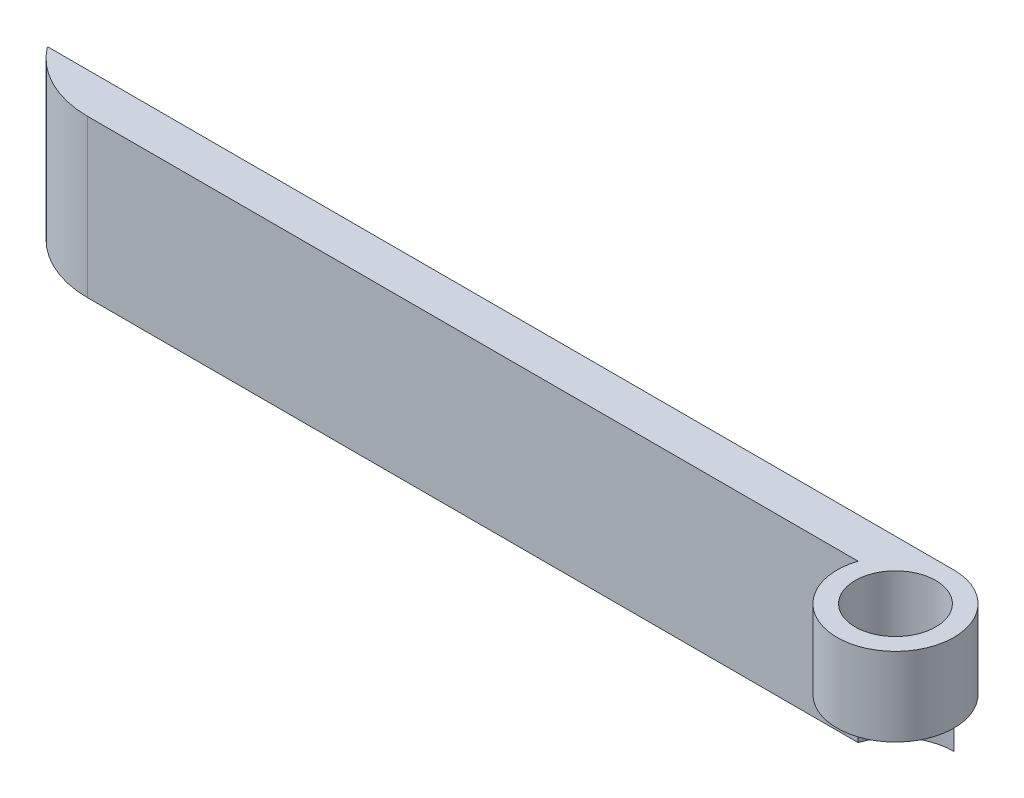
ISO-10303-21;
HEADER;
FILE_DESCRIPTION(('STEP AP214'),'2;1');
FILE_NAME('part.step','',(''),(''),'','','');
FILE_SCHEMA(('AUTOMOTIVE_DESIGN { 1 0 10303 214 1 1 1 1 }'));
ENDSEC;
DATA;
#1=APPLICATION_CONTEXT('core data for automotive mechanical design processes');
#2=APPLICATION_PROTOCOL_DEFINITION('international standard','automotive_design',2000,#1);
#3=PRODUCT_CONTEXT('',#1,'mechanical');
#4=PRODUCT('Part','Part','',(#3));
#5=PRODUCT_RELATED_PRODUCT_CATEGORY('part','',(#4));
#6=PRODUCT_DEFINITION_FORMATION('','',#4);
#7=PRODUCT_DEFINITION_CONTEXT('part definition',#1,'design');
#8=PRODUCT_DEFINITION('design','',#6,#7);
#9=PRODUCT_DEFINITION_SHAPE('','',#8);
#10=(LENGTH_UNIT() NAMED_UNIT(*) SI_UNIT(.MILLI.,.METRE.));
#11=(NAMED_UNIT(*) PLANE_ANGLE_UNIT() SI_UNIT($,.RADIAN.));
#12=(NAMED_UNIT(*) SI_UNIT($,.STERADIAN.) SOLID_ANGLE_UNIT());
#13=UNCERTAINTY_MEASURE_WITH_UNIT(LENGTH_MEASURE(1.E-05),#10,'distance_accuracy_value','');
#14=(GEOMETRIC_REPRESENTATION_CONTEXT(3) GLOBAL_UNCERTAINTY_ASSIGNED_CONTEXT((#13)) GLOBAL_UNIT_ASSIGNED_CONTEXT((#10,
#11,#12)) REPRESENTATION_CONTEXT('',''));
#15=CARTESIAN_POINT('',(0.,0.,0.));
#16=DIRECTION('',(0.,0.,1.));
#17=DIRECTION('',(1.,0.,0.));
#18=AXIS2_PLACEMENT_3D('',#15,#16,#17);
#19=CARTESIAN_POINT('',(0.,3.9,0.));
#20=DIRECTION('',(0.,-1.,0.));
#21=DIRECTION('',(0.,0.,-1.));
#22=AXIS2_PLACEMENT_3D('',#19,#20,#21);
#23=CYLINDRICAL_SURFACE('',#22,2.9);
#24=DIRECTION('',(0.,-1.,0.));
#25=VECTOR('',#24,1.);
#26=CARTESIAN_POINT('',(-2.75680975041804,3.9,-0.900000000000001));
#27=LINE('',#26,#25);
#28=CARTESIAN_POINT('',(-2.75680975041804,3.9,-0.900000000000001));
#29=VERTEX_POINT('',#28);
#30=CARTESIAN_POINT('',(-2.75680975041804,0.,-0.900000000000001));
#31=VERTEX_POINT('',#30);
#32=EDGE_CURVE('E112',#29,#31,#27,.T.);
#33=ORIENTED_EDGE('',*,*,#32,.T.);
#34=CARTESIAN_POINT('',(0.,0.,0.));
#35=DIRECTION('',(0.,1.,0.));
#36=DIRECTION('',(0.,0.,1.));
#37=AXIS2_PLACEMENT_3D('',#34,#35,#36);
#38=CIRCLE('',#37,2.9);
#39=CARTESIAN_POINT('',(0.,0.,-2.9));
#40=VERTEX_POINT('',#39);
#41=EDGE_CURVE('E108',#31,#40,#38,.T.);
#42=ORIENTED_EDGE('',*,*,#41,.T.);
#43=DIRECTION('',(0.,-1.,0.));
#44=VECTOR('',#43,1.);
#45=CARTESIAN_POINT('',(0.,3.9,-2.9));
#46=LINE('',#45,#44);
#47=CARTESIAN_POINT('',(0.,3.9,-2.9));
#48=VERTEX_POINT('',#47);
#49=EDGE_CURVE('E99',#48,#40,#46,.T.);
#50=ORIENTED_EDGE('',*,*,#49,.F.);
#51=CARTESIAN_POINT('',(0.,3.9,0.));
#52=DIRECTION('',(0.,1.,0.));
#53=DIRECTION('',(0.,0.,1.));
#54=AXIS2_PLACEMENT_3D('',#51,#52,#53);
#55=CIRCLE('',#54,2.9);
#56=EDGE_CURVE('E113',#29,#48,#55,.T.);
#57=ORIENTED_EDGE('',*,*,#56,.F.);
#58=EDGE_LOOP('',(#33,#42,#50,#57));
#59=FACE_BOUND('',#58,.T.);
#60=ADVANCED_FACE('F37',(#59),#23,.T.);
#61=CARTESIAN_POINT('',(0.,3.9,0.));
#62=DIRECTION('',(0.,1.,0.));
#63=DIRECTION('',(0.,0.,1.));
#64=AXIS2_PLACEMENT_3D('',#61,#62,#63);
#65=PLANE('',#64);
#66=DIRECTION('',(-1.,0.,0.));
#67=VECTOR('',#66,1.);
#68=CARTESIAN_POINT('',(0.,3.9,-2.9));
#69=LINE('',#68,#67);
#70=CARTESIAN_POINT('',(-45.,3.9,-2.90000000000001));
#71=VERTEX_POINT('',#70);
#72=EDGE_CURVE('E97',#48,#71,#69,.T.);
#73=ORIENTED_EDGE('',*,*,#72,.T.);
#74=CARTESIAN_POINT('',(-41.,3.9,-5.9));
#75=DIRECTION('',(0.,1.,0.));
#76=DIRECTION('',(0.,0.,1.));
#77=AXIS2_PLACEMENT_3D('',#74,#75,#76);
#78=CIRCLE('',#77,5.);
#79=CARTESIAN_POINT('',(-41.,3.9,-0.900000000000005));
#80=VERTEX_POINT('',#79);
#81=EDGE_CURVE('E11',#71,#80,#78,.T.);
#82=ORIENTED_EDGE('',*,*,#81,.T.);
#83=DIRECTION('',(1.,0.,0.));
#84=VECTOR('',#83,1.);
#85=CARTESIAN_POINT('',(0.,3.9,-0.900000000000001));
#86=LINE('',#85,#84);
#87=EDGE_CURVE('E101',#80,#29,#86,.T.);
#88=ORIENTED_EDGE('',*,*,#87,.T.);
#89=ORIENTED_EDGE('',*,*,#56,.T.);
#90=EDGE_LOOP('',(#73,#82,#88,#89));
#91=FACE_BOUND('',#90,.T.);
#92=CARTESIAN_POINT('',(0.,3.9,0.));
#93=DIRECTION('',(0.,1.,0.));
#94=DIRECTION('',(0.,0.,1.));
#95=AXIS2_PLACEMENT_3D('',#92,#93,#94);
#96=CIRCLE('',#95,2.);
#97=CARTESIAN_POINT('',(0.,3.9,2.));
#98=VERTEX_POINT('',#97);
#99=EDGE_CURVE('E105',#98,#98,#96,.T.);
#100=ORIENTED_EDGE('',*,*,#99,.F.);
#101=EDGE_LOOP('',(#100));
#102=FACE_BOUND('',#101,.T.);
#103=ADVANCED_FACE('F152',(#91,#102),#65,.T.);
#104=CARTESIAN_POINT('',(0.,0.,0.));
#105=DIRECTION('',(0.,1.,0.));
#106=DIRECTION('',(0.,0.,1.));
#107=AXIS2_PLACEMENT_3D('',#104,#105,#106);
#108=PLANE('',#107);
#109=EDGE_CURVE('E116',#40,#31,#38,.T.);
#110=ORIENTED_EDGE('',*,*,#109,.F.);
#111=ORIENTED_EDGE('',*,*,#41,.F.);
#112=EDGE_LOOP('',(#110,#111));
#113=FACE_BOUND('',#112,.T.);
#114=CARTESIAN_POINT('',(0.,0.,0.));
#115=DIRECTION('',(0.,1.,0.));
#116=DIRECTION('',(0.,0.,1.));
#117=AXIS2_PLACEMENT_3D('',#114,#115,#116);
#118=CIRCLE('',#117,2.);
#119=CARTESIAN_POINT('',(0.,0.,2.));
#120=VERTEX_POINT('',#119);
#121=EDGE_CURVE('E109',#120,#120,#118,.T.);
#122=ORIENTED_EDGE('',*,*,#121,.T.);
#123=EDGE_LOOP('',(#122));
#124=FACE_BOUND('',#123,.T.);
#125=ADVANCED_FACE('F135',(#113,#124),#108,.F.);
#126=CARTESIAN_POINT('',(0.,3.9,0.));
#127=DIRECTION('',(0.,-1.,0.));
#128=DIRECTION('',(0.,0.,-1.));
#129=AXIS2_PLACEMENT_3D('',#126,#127,#128);
#130=CYLINDRICAL_SURFACE('',#129,2.);
#131=ORIENTED_EDGE('',*,*,#99,.T.);
#132=EDGE_LOOP('',(#131));
#133=FACE_BOUND('',#132,.T.);
#134=ORIENTED_EDGE('',*,*,#121,.F.);
#135=EDGE_LOOP('',(#134));
#136=FACE_BOUND('',#135,.T.);
#137=ADVANCED_FACE('F139',(#133,#136),#130,.F.);
#138=CARTESIAN_POINT('',(0.,3.9,0.));
#139=DIRECTION('',(0.,-1.,0.));
#140=DIRECTION('',(0.,0.,-1.));
#141=AXIS2_PLACEMENT_3D('',#138,#139,#140);
#142=CYLINDRICAL_SURFACE('',#141,2.9);
#143=CARTESIAN_POINT('',(0.,-3.9,-2.9));
#144=VERTEX_POINT('',#143);
#145=EDGE_CURVE('E94',#40,#144,#46,.T.);
#146=ORIENTED_EDGE('',*,*,#145,.F.);
#147=ORIENTED_EDGE('',*,*,#109,.T.);
#148=CARTESIAN_POINT('',(-2.75680975041804,-3.9,-0.900000000000001));
#149=VERTEX_POINT('',#148);
#150=EDGE_CURVE('E127',#31,#149,#27,.T.);
#151=ORIENTED_EDGE('',*,*,#150,.T.);
#152=CARTESIAN_POINT('',(0.,-3.9,0.));
#153=DIRECTION('',(0.,-1.,0.));
#154=DIRECTION('',(0.,0.,-1.));
#155=AXIS2_PLACEMENT_3D('',#152,#153,#154);
#156=CIRCLE('',#155,2.9);
#157=EDGE_CURVE('E95',#149,#144,#156,.T.);
#158=ORIENTED_EDGE('',*,*,#157,.T.);
#159=EDGE_LOOP('',(#146,#147,#151,#158));
#160=FACE_BOUND('',#159,.T.);
#161=ADVANCED_FACE('F137',(#160),#142,.F.);
#162=CARTESIAN_POINT('',(0.,3.9,-0.900000000000001));
#163=DIRECTION('',(0.,0.,-1.));
#164=DIRECTION('',(-1.,0.,0.));
#165=AXIS2_PLACEMENT_3D('',#162,#163,#164);
#166=PLANE('',#165);
#167=ORIENTED_EDGE('',*,*,#87,.F.);
#168=DIRECTION('',(0.,-1.,0.));
#169=VECTOR('',#168,1.);
#170=CARTESIAN_POINT('',(-41.,3.9,-0.900000000000005));
#171=LINE('',#170,#169);
#172=CARTESIAN_POINT('',(-41.,-3.9,-0.900000000000005));
#173=VERTEX_POINT('',#172);
#174=EDGE_CURVE('E88',#80,#173,#171,.T.);
#175=ORIENTED_EDGE('',*,*,#174,.T.);
#176=DIRECTION('',(1.,0.,0.));
#177=VECTOR('',#176,1.);
#178=CARTESIAN_POINT('',(0.,-3.9,-0.900000000000001));
#179=LINE('',#178,#177);
#180=EDGE_CURVE('E87',#173,#149,#179,.T.);
#181=ORIENTED_EDGE('',*,*,#180,.T.);
#182=ORIENTED_EDGE('',*,*,#150,.F.);
#183=ORIENTED_EDGE('',*,*,#32,.F.);
#184=EDGE_LOOP('',(#167,#175,#181,#182,#183));
#185=FACE_BOUND('',#184,.T.);
#186=ADVANCED_FACE('F119',(#185),#166,.F.);
#187=CARTESIAN_POINT('',(0.,3.9,-2.9));
#188=DIRECTION('',(0.,0.,1.));
#189=DIRECTION('',(1.,0.,0.));
#190=AXIS2_PLACEMENT_3D('',#187,#188,#189);
#191=PLANE('',#190);
#192=ORIENTED_EDGE('',*,*,#49,.T.);
#193=ORIENTED_EDGE('',*,*,#145,.T.);
#194=DIRECTION('',(-1.,0.,0.));
#195=VECTOR('',#194,1.);
#196=CARTESIAN_POINT('',(0.,-3.9,-2.9));
#197=LINE('',#196,#195);
#198=CARTESIAN_POINT('',(-45.,-3.9,-2.90000000000001));
#199=VERTEX_POINT('',#198);
#200=EDGE_CURVE('E85',#144,#199,#197,.T.);
#201=ORIENTED_EDGE('',*,*,#200,.T.);
#202=DIRECTION('',(0.,-1.,0.));
#203=VECTOR('',#202,1.);
#204=CARTESIAN_POINT('',(-45.,3.9,-2.90000000000001));
#205=LINE('',#204,#203);
#206=EDGE_CURVE('E93',#71,#199,#205,.T.);
#207=ORIENTED_EDGE('',*,*,#206,.F.);
#208=ORIENTED_EDGE('',*,*,#72,.F.);
#209=EDGE_LOOP('',(#192,#193,#201,#207,#208));
#210=FACE_BOUND('',#209,.T.);
#211=ADVANCED_FACE('F92',(#210),#191,.F.);
#212=CARTESIAN_POINT('',(0.,-3.9,0.));
#213=DIRECTION('',(0.,-1.,0.));
#214=DIRECTION('',(0.,0.,-1.));
#215=AXIS2_PLACEMENT_3D('',#212,#213,#214);
#216=PLANE('',#215);
#217=ORIENTED_EDGE('',*,*,#180,.F.);
#218=CARTESIAN_POINT('',(-41.,-3.9,-5.9));
#219=DIRECTION('',(0.,-1.,0.));
#220=DIRECTION('',(0.,0.,-1.));
#221=AXIS2_PLACEMENT_3D('',#218,#219,#220);
#222=CIRCLE('',#221,5.);
#223=EDGE_CURVE('E45',#173,#199,#222,.T.);
#224=ORIENTED_EDGE('',*,*,#223,.T.);
#225=ORIENTED_EDGE('',*,*,#200,.F.);
#226=ORIENTED_EDGE('',*,*,#157,.F.);
#227=EDGE_LOOP('',(#217,#224,#225,#226));
#228=FACE_BOUND('',#227,.T.);
#229=ADVANCED_FACE('F83',(#228),#216,.T.);
#230=CARTESIAN_POINT('',(-41.,3.9,-5.9));
#231=DIRECTION('',(0.,-1.,0.));
#232=DIRECTION('',(0.,0.,-1.));
#233=AXIS2_PLACEMENT_3D('',#230,#231,#232);
#234=CYLINDRICAL_SURFACE('',#233,5.);
#235=ORIENTED_EDGE('',*,*,#81,.F.);
#236=ORIENTED_EDGE('',*,*,#206,.T.);
#237=ORIENTED_EDGE('',*,*,#223,.F.);
#238=ORIENTED_EDGE('',*,*,#174,.F.);
#239=EDGE_LOOP('',(#235,#236,#237,#238));
#240=FACE_BOUND('',#239,.T.);
#241=ADVANCED_FACE('F39',(#240),#234,.T.);
#242=CLOSED_SHELL('',(#60,#103,#125,#137,#161,#186,#211,#229,#241));
#243=MANIFOLD_SOLID_BREP('B2',#242);
#244=ADVANCED_BREP_SHAPE_REPRESENTATION('',(#18,#243),#14);
#245=SHAPE_DEFINITION_REPRESENTATION(#9,#244);
ENDSEC;
END-ISO-10303-21;
